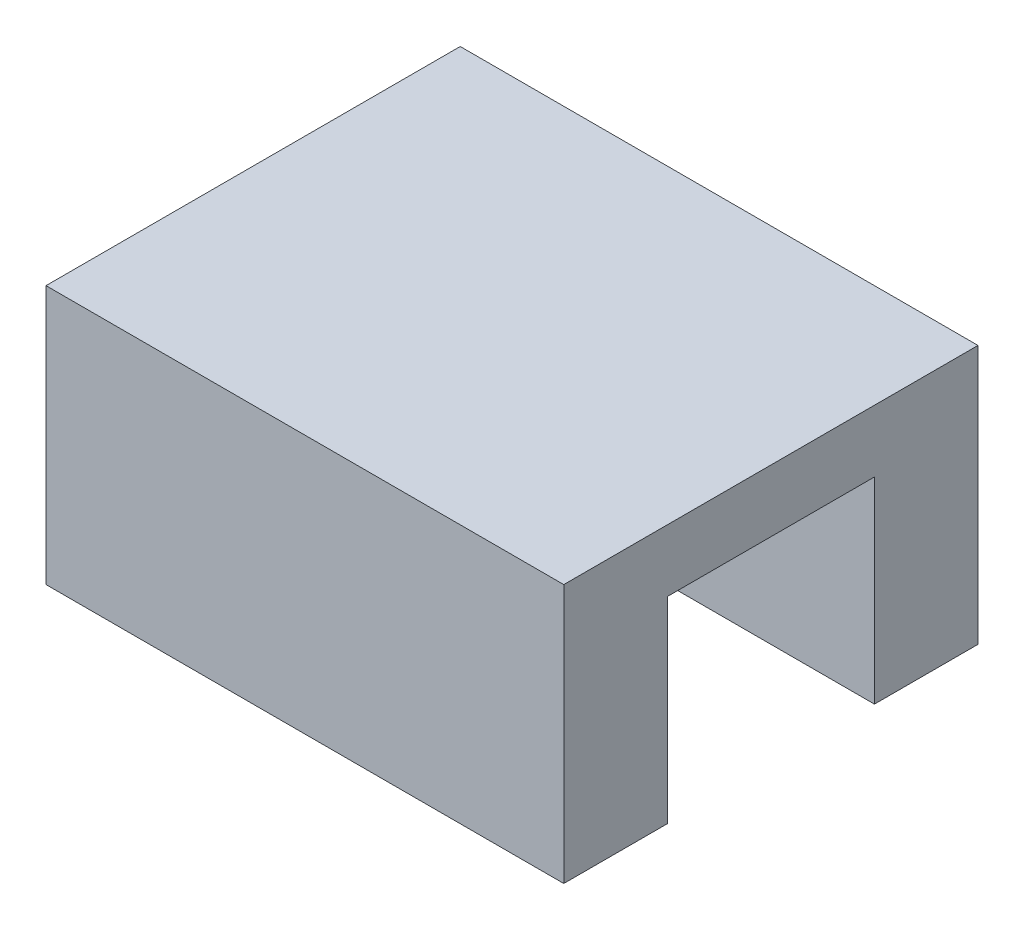
ISO-10303-21;
HEADER;
FILE_DESCRIPTION(('STEP AP214'),'2;1');
FILE_NAME('part.step','',(''),(''),'','','');
FILE_SCHEMA(('AUTOMOTIVE_DESIGN { 1 0 10303 214 1 1 1 1 }'));
ENDSEC;
DATA;
#1=APPLICATION_CONTEXT('core data for automotive mechanical design processes');
#2=APPLICATION_PROTOCOL_DEFINITION('international standard','automotive_design',2000,#1);
#3=PRODUCT_CONTEXT('',#1,'mechanical');
#4=PRODUCT('Part','Part','',(#3));
#5=PRODUCT_RELATED_PRODUCT_CATEGORY('part','',(#4));
#6=PRODUCT_DEFINITION_FORMATION('','',#4);
#7=PRODUCT_DEFINITION_CONTEXT('part definition',#1,'design');
#8=PRODUCT_DEFINITION('design','',#6,#7);
#9=PRODUCT_DEFINITION_SHAPE('','',#8);
#10=(LENGTH_UNIT() NAMED_UNIT(*) SI_UNIT(.MILLI.,.METRE.));
#11=(NAMED_UNIT(*) PLANE_ANGLE_UNIT() SI_UNIT($,.RADIAN.));
#12=(NAMED_UNIT(*) SI_UNIT($,.STERADIAN.) SOLID_ANGLE_UNIT());
#13=UNCERTAINTY_MEASURE_WITH_UNIT(LENGTH_MEASURE(1.E-05),#10,'distance_accuracy_value','');
#14=(GEOMETRIC_REPRESENTATION_CONTEXT(3) GLOBAL_UNCERTAINTY_ASSIGNED_CONTEXT((#13)) GLOBAL_UNIT_ASSIGNED_CONTEXT((#10,
#11,#12)) REPRESENTATION_CONTEXT('',''));
#15=CARTESIAN_POINT('',(0.,0.,0.));
#16=DIRECTION('',(0.,0.,1.));
#17=DIRECTION('',(1.,0.,0.));
#18=AXIS2_PLACEMENT_3D('',#15,#16,#17);
#19=CARTESIAN_POINT('',(0.,0.,10.));
#20=DIRECTION('',(1.,0.,0.));
#21=DIRECTION('',(0.,0.,-1.));
#22=AXIS2_PLACEMENT_3D('',#19,#20,#21);
#23=PLANE('',#22);
#24=DIRECTION('',(0.,0.,-1.));
#25=VECTOR('',#24,1.);
#26=CARTESIAN_POINT('',(0.,25.,10.));
#27=LINE('',#26,#25);
#28=CARTESIAN_POINT('',(0.,25.,10.));
#29=VERTEX_POINT('',#28);
#30=CARTESIAN_POINT('',(0.,25.,-30.));
#31=VERTEX_POINT('',#30);
#32=EDGE_CURVE('E114',#29,#31,#27,.T.);
#33=ORIENTED_EDGE('',*,*,#32,.T.);
#34=DIRECTION('',(0.,1.,0.));
#35=VECTOR('',#34,1.);
#36=CARTESIAN_POINT('',(0.,25.,-30.));
#37=LINE('',#36,#35);
#38=CARTESIAN_POINT('',(0.,0.,-30.));
#39=VERTEX_POINT('',#38);
#40=EDGE_CURVE('E129',#39,#31,#37,.T.);
#41=ORIENTED_EDGE('',*,*,#40,.F.);
#42=DIRECTION('',(0.,0.,1.));
#43=VECTOR('',#42,1.);
#44=CARTESIAN_POINT('',(0.,0.,-30.));
#45=LINE('',#44,#43);
#46=CARTESIAN_POINT('',(0.,0.,-20.));
#47=VERTEX_POINT('',#46);
#48=EDGE_CURVE('E138',#39,#47,#45,.T.);
#49=ORIENTED_EDGE('',*,*,#48,.T.);
#50=DIRECTION('',(0.,1.,0.));
#51=VECTOR('',#50,1.);
#52=CARTESIAN_POINT('',(0.,25.,-20.));
#53=LINE('',#52,#51);
#54=CARTESIAN_POINT('',(0.,19.,-20.));
#55=VERTEX_POINT('',#54);
#56=EDGE_CURVE('E130',#47,#55,#53,.T.);
#57=ORIENTED_EDGE('',*,*,#56,.T.);
#58=DIRECTION('',(0.,0.,1.));
#59=VECTOR('',#58,1.);
#60=CARTESIAN_POINT('',(0.,19.,-20.));
#61=LINE('',#60,#59);
#62=CARTESIAN_POINT('',(0.,19.,0.));
#63=VERTEX_POINT('',#62);
#64=EDGE_CURVE('E155',#55,#63,#61,.T.);
#65=ORIENTED_EDGE('',*,*,#64,.T.);
#66=DIRECTION('',(0.,-1.,0.));
#67=VECTOR('',#66,1.);
#68=CARTESIAN_POINT('',(0.,0.,0.));
#69=LINE('',#68,#67);
#70=CARTESIAN_POINT('',(0.,0.,0.));
#71=VERTEX_POINT('',#70);
#72=EDGE_CURVE('E207',#63,#71,#69,.T.);
#73=ORIENTED_EDGE('',*,*,#72,.T.);
#74=DIRECTION('',(0.,0.,-1.));
#75=VECTOR('',#74,1.);
#76=CARTESIAN_POINT('',(0.,0.,10.));
#77=LINE('',#76,#75);
#78=CARTESIAN_POINT('',(0.,0.,10.));
#79=VERTEX_POINT('',#78);
#80=EDGE_CURVE('E11',#79,#71,#77,.T.);
#81=ORIENTED_EDGE('',*,*,#80,.F.);
#82=DIRECTION('',(0.,-1.,0.));
#83=VECTOR('',#82,1.);
#84=CARTESIAN_POINT('',(0.,0.,10.));
#85=LINE('',#84,#83);
#86=EDGE_CURVE('E149',#29,#79,#85,.T.);
#87=ORIENTED_EDGE('',*,*,#86,.F.);
#88=EDGE_LOOP('',(#33,#41,#49,#57,#65,#73,#81,#87));
#89=FACE_BOUND('',#88,.T.);
#90=ADVANCED_FACE('F33',(#89),#23,.F.);
#91=CARTESIAN_POINT('',(0.,0.,10.));
#92=DIRECTION('',(0.,1.,0.));
#93=DIRECTION('',(0.,0.,1.));
#94=AXIS2_PLACEMENT_3D('',#91,#92,#93);
#95=PLANE('',#94);
#96=DIRECTION('',(1.,0.,0.));
#97=VECTOR('',#96,1.);
#98=CARTESIAN_POINT('',(0.,0.,0.));
#99=LINE('',#98,#97);
#100=CARTESIAN_POINT('',(50.,0.,0.));
#101=VERTEX_POINT('',#100);
#102=EDGE_CURVE('E74',#71,#101,#99,.T.);
#103=ORIENTED_EDGE('',*,*,#102,.T.);
#104=DIRECTION('',(0.,0.,-1.));
#105=VECTOR('',#104,1.);
#106=CARTESIAN_POINT('',(50.,0.,10.));
#107=LINE('',#106,#105);
#108=CARTESIAN_POINT('',(50.,0.,10.));
#109=VERTEX_POINT('',#108);
#110=EDGE_CURVE('E42',#109,#101,#107,.T.);
#111=ORIENTED_EDGE('',*,*,#110,.F.);
#112=DIRECTION('',(1.,0.,0.));
#113=VECTOR('',#112,1.);
#114=CARTESIAN_POINT('',(0.,0.,10.));
#115=LINE('',#114,#113);
#116=EDGE_CURVE('E79',#79,#109,#115,.T.);
#117=ORIENTED_EDGE('',*,*,#116,.F.);
#118=ORIENTED_EDGE('',*,*,#80,.T.);
#119=EDGE_LOOP('',(#103,#111,#117,#118));
#120=FACE_BOUND('',#119,.T.);
#121=ADVANCED_FACE('F185',(#120),#95,.F.);
#122=CARTESIAN_POINT('',(50.,0.,10.));
#123=DIRECTION('',(-1.,0.,0.));
#124=DIRECTION('',(0.,0.,1.));
#125=AXIS2_PLACEMENT_3D('',#122,#123,#124);
#126=PLANE('',#125);
#127=DIRECTION('',(0.,1.,0.));
#128=VECTOR('',#127,1.);
#129=CARTESIAN_POINT('',(50.,0.,0.));
#130=LINE('',#129,#128);
#131=CARTESIAN_POINT('',(50.,19.,0.));
#132=VERTEX_POINT('',#131);
#133=EDGE_CURVE('E206',#101,#132,#130,.T.);
#134=ORIENTED_EDGE('',*,*,#133,.T.);
#135=DIRECTION('',(0.,0.,-1.));
#136=VECTOR('',#135,1.);
#137=CARTESIAN_POINT('',(50.,19.,0.));
#138=LINE('',#137,#136);
#139=CARTESIAN_POINT('',(50.,19.,-20.));
#140=VERTEX_POINT('',#139);
#141=EDGE_CURVE('E50',#132,#140,#138,.T.);
#142=ORIENTED_EDGE('',*,*,#141,.T.);
#143=DIRECTION('',(0.,-1.,0.));
#144=VECTOR('',#143,1.);
#145=CARTESIAN_POINT('',(50.,25.,-20.));
#146=LINE('',#145,#144);
#147=CARTESIAN_POINT('',(50.,0.,-20.));
#148=VERTEX_POINT('',#147);
#149=EDGE_CURVE('E143',#140,#148,#146,.T.);
#150=ORIENTED_EDGE('',*,*,#149,.T.);
#151=DIRECTION('',(0.,0.,1.));
#152=VECTOR('',#151,1.);
#153=CARTESIAN_POINT('',(50.,0.,-30.));
#154=LINE('',#153,#152);
#155=CARTESIAN_POINT('',(50.,0.,-30.));
#156=VERTEX_POINT('',#155);
#157=EDGE_CURVE('E121',#156,#148,#154,.T.);
#158=ORIENTED_EDGE('',*,*,#157,.F.);
#159=DIRECTION('',(0.,-1.,0.));
#160=VECTOR('',#159,1.);
#161=CARTESIAN_POINT('',(50.,25.,-30.));
#162=LINE('',#161,#160);
#163=CARTESIAN_POINT('',(50.,25.,-30.));
#164=VERTEX_POINT('',#163);
#165=EDGE_CURVE('E117',#164,#156,#162,.T.);
#166=ORIENTED_EDGE('',*,*,#165,.F.);
#167=DIRECTION('',(0.,0.,-1.));
#168=VECTOR('',#167,1.);
#169=CARTESIAN_POINT('',(50.,25.,10.));
#170=LINE('',#169,#168);
#171=CARTESIAN_POINT('',(50.,25.,10.));
#172=VERTEX_POINT('',#171);
#173=EDGE_CURVE('E107',#172,#164,#170,.T.);
#174=ORIENTED_EDGE('',*,*,#173,.F.);
#175=DIRECTION('',(0.,1.,0.));
#176=VECTOR('',#175,1.);
#177=CARTESIAN_POINT('',(50.,0.,10.));
#178=LINE('',#177,#176);
#179=EDGE_CURVE('E216',#109,#172,#178,.T.);
#180=ORIENTED_EDGE('',*,*,#179,.F.);
#181=ORIENTED_EDGE('',*,*,#110,.T.);
#182=EDGE_LOOP('',(#134,#142,#150,#158,#166,#174,#180,#181));
#183=FACE_BOUND('',#182,.T.);
#184=ADVANCED_FACE('F119',(#183),#126,.F.);
#185=CARTESIAN_POINT('',(50.,25.,10.));
#186=DIRECTION('',(0.,-1.,0.));
#187=DIRECTION('',(1.,0.,0.));
#188=AXIS2_PLACEMENT_3D('',#185,#186,#187);
#189=PLANE('',#188);
#190=ORIENTED_EDGE('',*,*,#173,.T.);
#191=DIRECTION('',(1.,0.,0.));
#192=VECTOR('',#191,1.);
#193=CARTESIAN_POINT('',(0.,25.,-30.));
#194=LINE('',#193,#192);
#195=EDGE_CURVE('E111',#31,#164,#194,.T.);
#196=ORIENTED_EDGE('',*,*,#195,.F.);
#197=ORIENTED_EDGE('',*,*,#32,.F.);
#198=DIRECTION('',(-1.,0.,0.));
#199=VECTOR('',#198,1.);
#200=CARTESIAN_POINT('',(50.,25.,10.));
#201=LINE('',#200,#199);
#202=EDGE_CURVE('E59',#172,#29,#201,.T.);
#203=ORIENTED_EDGE('',*,*,#202,.F.);
#204=EDGE_LOOP('',(#190,#196,#197,#203));
#205=FACE_BOUND('',#204,.T.);
#206=ADVANCED_FACE('F109',(#205),#189,.F.);
#207=CARTESIAN_POINT('',(0.,0.,10.));
#208=DIRECTION('',(0.,0.,1.));
#209=DIRECTION('',(1.,0.,0.));
#210=AXIS2_PLACEMENT_3D('',#207,#208,#209);
#211=PLANE('',#210);
#212=ORIENTED_EDGE('',*,*,#86,.T.);
#213=ORIENTED_EDGE('',*,*,#116,.T.);
#214=ORIENTED_EDGE('',*,*,#179,.T.);
#215=ORIENTED_EDGE('',*,*,#202,.T.);
#216=EDGE_LOOP('',(#212,#213,#214,#215));
#217=FACE_BOUND('',#216,.T.);
#218=ADVANCED_FACE('F196',(#217),#211,.T.);
#219=CARTESIAN_POINT('',(0.,0.,0.));
#220=DIRECTION('',(0.,0.,1.));
#221=DIRECTION('',(1.,0.,0.));
#222=AXIS2_PLACEMENT_3D('',#219,#220,#221);
#223=PLANE('',#222);
#224=ORIENTED_EDGE('',*,*,#72,.F.);
#225=DIRECTION('',(1.,0.,0.));
#226=VECTOR('',#225,1.);
#227=CARTESIAN_POINT('',(0.,19.,0.));
#228=LINE('',#227,#226);
#229=EDGE_CURVE('E152',#63,#132,#228,.T.);
#230=ORIENTED_EDGE('',*,*,#229,.T.);
#231=ORIENTED_EDGE('',*,*,#133,.F.);
#232=ORIENTED_EDGE('',*,*,#102,.F.);
#233=EDGE_LOOP('',(#224,#230,#231,#232));
#234=FACE_BOUND('',#233,.T.);
#235=ADVANCED_FACE('F197',(#234),#223,.F.);
#236=CARTESIAN_POINT('',(0.,19.,0.));
#237=DIRECTION('',(0.,1.,0.));
#238=DIRECTION('',(-1.,0.,0.));
#239=AXIS2_PLACEMENT_3D('',#236,#237,#238);
#240=PLANE('',#239);
#241=DIRECTION('',(-1.,0.,0.));
#242=VECTOR('',#241,1.);
#243=CARTESIAN_POINT('',(50.,19.,-20.));
#244=LINE('',#243,#242);
#245=EDGE_CURVE('E36',#140,#55,#244,.T.);
#246=ORIENTED_EDGE('',*,*,#245,.F.);
#247=ORIENTED_EDGE('',*,*,#141,.F.);
#248=ORIENTED_EDGE('',*,*,#229,.F.);
#249=ORIENTED_EDGE('',*,*,#64,.F.);
#250=EDGE_LOOP('',(#246,#247,#248,#249));
#251=FACE_BOUND('',#250,.T.);
#252=ADVANCED_FACE('F181',(#251),#240,.F.);
#253=CARTESIAN_POINT('',(0.,0.,-20.));
#254=DIRECTION('',(0.,0.,-1.));
#255=DIRECTION('',(-1.,0.,0.));
#256=AXIS2_PLACEMENT_3D('',#253,#254,#255);
#257=PLANE('',#256);
#258=ORIENTED_EDGE('',*,*,#149,.F.);
#259=ORIENTED_EDGE('',*,*,#245,.T.);
#260=ORIENTED_EDGE('',*,*,#56,.F.);
#261=DIRECTION('',(-1.,0.,0.));
#262=VECTOR('',#261,1.);
#263=CARTESIAN_POINT('',(50.,0.,-20.));
#264=LINE('',#263,#262);
#265=EDGE_CURVE('E133',#148,#47,#264,.T.);
#266=ORIENTED_EDGE('',*,*,#265,.F.);
#267=EDGE_LOOP('',(#258,#259,#260,#266));
#268=FACE_BOUND('',#267,.T.);
#269=ADVANCED_FACE('F172',(#268),#257,.F.);
#270=CARTESIAN_POINT('',(50.,0.,-30.));
#271=DIRECTION('',(0.,1.,0.));
#272=DIRECTION('',(0.,0.,1.));
#273=AXIS2_PLACEMENT_3D('',#270,#271,#272);
#274=PLANE('',#273);
#275=ORIENTED_EDGE('',*,*,#265,.T.);
#276=ORIENTED_EDGE('',*,*,#48,.F.);
#277=DIRECTION('',(-1.,0.,0.));
#278=VECTOR('',#277,1.);
#279=CARTESIAN_POINT('',(50.,0.,-30.));
#280=LINE('',#279,#278);
#281=EDGE_CURVE('E124',#156,#39,#280,.T.);
#282=ORIENTED_EDGE('',*,*,#281,.F.);
#283=ORIENTED_EDGE('',*,*,#157,.T.);
#284=EDGE_LOOP('',(#275,#276,#282,#283));
#285=FACE_BOUND('',#284,.T.);
#286=ADVANCED_FACE('F173',(#285),#274,.F.);
#287=CARTESIAN_POINT('',(0.,0.,-30.));
#288=DIRECTION('',(0.,0.,-1.));
#289=DIRECTION('',(-1.,0.,0.));
#290=AXIS2_PLACEMENT_3D('',#287,#288,#289);
#291=PLANE('',#290);
#292=ORIENTED_EDGE('',*,*,#195,.T.);
#293=ORIENTED_EDGE('',*,*,#165,.T.);
#294=ORIENTED_EDGE('',*,*,#281,.T.);
#295=ORIENTED_EDGE('',*,*,#40,.T.);
#296=EDGE_LOOP('',(#292,#293,#294,#295));
#297=FACE_BOUND('',#296,.T.);
#298=ADVANCED_FACE('F127',(#297),#291,.T.);
#299=CLOSED_SHELL('',(#90,#121,#184,#206,#218,#235,#252,#269,#286,#298));
#300=MANIFOLD_SOLID_BREP('B2',#299);
#301=ADVANCED_BREP_SHAPE_REPRESENTATION('',(#18,#300),#14);
#302=SHAPE_DEFINITION_REPRESENTATION(#9,#301);
ENDSEC;
END-ISO-10303-21;
